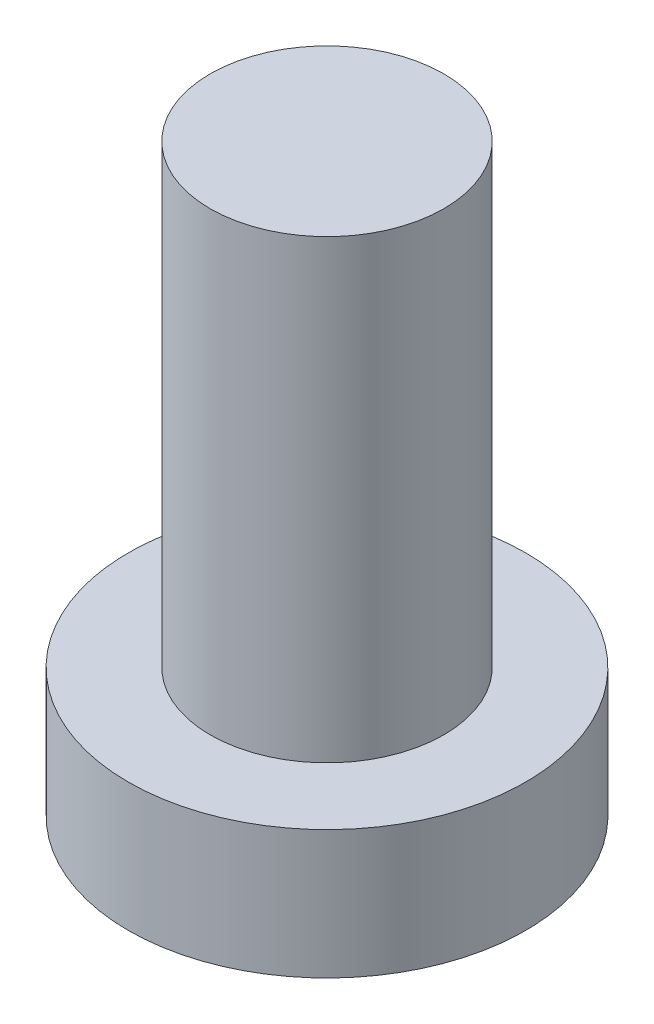
ISO-10303-21;
HEADER;
FILE_DESCRIPTION(('STEP AP214'),'2;1');
FILE_NAME('part.step','',(''),(''),'','','');
FILE_SCHEMA(('AUTOMOTIVE_DESIGN { 1 0 10303 214 1 1 1 1 }'));
ENDSEC;
DATA;
#1=APPLICATION_CONTEXT('core data for automotive mechanical design processes');
#2=APPLICATION_PROTOCOL_DEFINITION('international standard','automotive_design',2000,#1);
#3=PRODUCT_CONTEXT('',#1,'mechanical');
#4=PRODUCT('Part','Part','',(#3));
#5=PRODUCT_RELATED_PRODUCT_CATEGORY('part','',(#4));
#6=PRODUCT_DEFINITION_FORMATION('','',#4);
#7=PRODUCT_DEFINITION_CONTEXT('part definition',#1,'design');
#8=PRODUCT_DEFINITION('design','',#6,#7);
#9=PRODUCT_DEFINITION_SHAPE('','',#8);
#10=(LENGTH_UNIT() NAMED_UNIT(*) SI_UNIT(.MILLI.,.METRE.));
#11=(NAMED_UNIT(*) PLANE_ANGLE_UNIT() SI_UNIT($,.RADIAN.));
#12=(NAMED_UNIT(*) SI_UNIT($,.STERADIAN.) SOLID_ANGLE_UNIT());
#13=UNCERTAINTY_MEASURE_WITH_UNIT(LENGTH_MEASURE(1.E-05),#10,'distance_accuracy_value','');
#14=(GEOMETRIC_REPRESENTATION_CONTEXT(3) GLOBAL_UNCERTAINTY_ASSIGNED_CONTEXT((#13)) GLOBAL_UNIT_ASSIGNED_CONTEXT((#10,
#11,#12)) REPRESENTATION_CONTEXT('',''));
#15=CARTESIAN_POINT('',(0.,0.,0.));
#16=DIRECTION('',(0.,0.,1.));
#17=DIRECTION('',(1.,0.,0.));
#18=AXIS2_PLACEMENT_3D('',#15,#16,#17);
#19=CARTESIAN_POINT('',(0.,4.4,0.));
#20=DIRECTION('',(0.,-1.,0.));
#21=DIRECTION('',(0.,0.,-1.));
#22=AXIS2_PLACEMENT_3D('',#19,#20,#21);
#23=CYLINDRICAL_SURFACE('',#22,6.8);
#24=CARTESIAN_POINT('',(0.,4.4,0.));
#25=DIRECTION('',(0.,1.,0.));
#26=DIRECTION('',(0.,0.,1.));
#27=AXIS2_PLACEMENT_3D('',#24,#25,#26);
#28=CIRCLE('',#27,6.8);
#29=CARTESIAN_POINT('',(0.,4.4,6.8));
#30=VERTEX_POINT('',#29);
#31=EDGE_CURVE('E42',#30,#30,#28,.T.);
#32=ORIENTED_EDGE('',*,*,#31,.F.);
#33=EDGE_LOOP('',(#32));
#34=FACE_BOUND('',#33,.T.);
#35=CARTESIAN_POINT('',(0.,0.,0.));
#36=DIRECTION('',(0.,1.,0.));
#37=DIRECTION('',(0.,0.,1.));
#38=AXIS2_PLACEMENT_3D('',#35,#36,#37);
#39=CIRCLE('',#38,6.8);
#40=CARTESIAN_POINT('',(0.,0.,6.8));
#41=VERTEX_POINT('',#40);
#42=EDGE_CURVE('E38',#41,#41,#39,.T.);
#43=ORIENTED_EDGE('',*,*,#42,.T.);
#44=EDGE_LOOP('',(#43));
#45=FACE_BOUND('',#44,.T.);
#46=ADVANCED_FACE('F35',(#34,#45),#23,.T.);
#47=CARTESIAN_POINT('',(0.,4.4,0.));
#48=DIRECTION('',(0.,1.,0.));
#49=DIRECTION('',(0.,0.,1.));
#50=AXIS2_PLACEMENT_3D('',#47,#48,#49);
#51=PLANE('',#50);
#52=CARTESIAN_POINT('',(0.,4.4,0.));
#53=DIRECTION('',(0.,1.,0.));
#54=DIRECTION('',(0.,0.,1.));
#55=AXIS2_PLACEMENT_3D('',#52,#53,#54);
#56=CIRCLE('',#55,4.);
#57=CARTESIAN_POINT('',(0.,4.4,4.));
#58=VERTEX_POINT('',#57);
#59=EDGE_CURVE('E10',#58,#58,#56,.T.);
#60=ORIENTED_EDGE('',*,*,#59,.F.);
#61=EDGE_LOOP('',(#60));
#62=FACE_BOUND('',#61,.T.);
#63=ORIENTED_EDGE('',*,*,#31,.T.);
#64=EDGE_LOOP('',(#63));
#65=FACE_BOUND('',#64,.T.);
#66=ADVANCED_FACE('F59',(#62,#65),#51,.T.);
#67=CARTESIAN_POINT('',(0.,0.,0.));
#68=DIRECTION('',(0.,1.,0.));
#69=DIRECTION('',(0.,0.,1.));
#70=AXIS2_PLACEMENT_3D('',#67,#68,#69);
#71=PLANE('',#70);
#72=ORIENTED_EDGE('',*,*,#42,.F.);
#73=EDGE_LOOP('',(#72));
#74=FACE_BOUND('',#73,.T.);
#75=ADVANCED_FACE('F56',(#74),#71,.F.);
#76=CARTESIAN_POINT('',(0.,20.,0.));
#77=DIRECTION('',(0.,-1.,0.));
#78=DIRECTION('',(0.,0.,-1.));
#79=AXIS2_PLACEMENT_3D('',#76,#77,#78);
#80=CYLINDRICAL_SURFACE('',#79,4.);
#81=CARTESIAN_POINT('',(0.,20.,0.));
#82=DIRECTION('',(0.,1.,0.));
#83=DIRECTION('',(0.,0.,1.));
#84=AXIS2_PLACEMENT_3D('',#81,#82,#83);
#85=CIRCLE('',#84,4.);
#86=CARTESIAN_POINT('',(0.,20.,4.));
#87=VERTEX_POINT('',#86);
#88=EDGE_CURVE('E48',#87,#87,#85,.T.);
#89=ORIENTED_EDGE('',*,*,#88,.F.);
#90=EDGE_LOOP('',(#89));
#91=FACE_BOUND('',#90,.T.);
#92=ORIENTED_EDGE('',*,*,#59,.T.);
#93=EDGE_LOOP('',(#92));
#94=FACE_BOUND('',#93,.T.);
#95=ADVANCED_FACE('F58',(#91,#94),#80,.T.);
#96=CARTESIAN_POINT('',(0.,20.,0.));
#97=DIRECTION('',(0.,1.,0.));
#98=DIRECTION('',(0.,0.,1.));
#99=AXIS2_PLACEMENT_3D('',#96,#97,#98);
#100=PLANE('',#99);
#101=ORIENTED_EDGE('',*,*,#88,.T.);
#102=EDGE_LOOP('',(#101));
#103=FACE_BOUND('',#102,.T.);
#104=ADVANCED_FACE('F64',(#103),#100,.T.);
#105=CLOSED_SHELL('',(#46,#66,#75,#95,#104));
#106=MANIFOLD_SOLID_BREP('B2',#105);
#107=ADVANCED_BREP_SHAPE_REPRESENTATION('',(#18,#106),#14);
#108=SHAPE_DEFINITION_REPRESENTATION(#9,#107);
ENDSEC;
END-ISO-10303-21;
